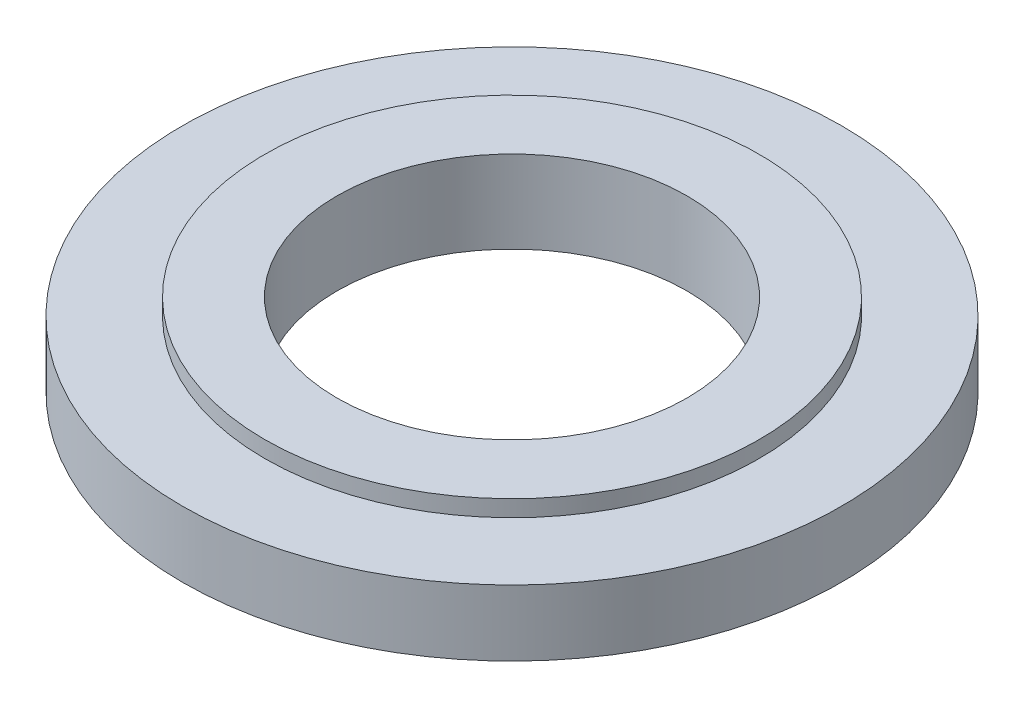
ISO-10303-21;
HEADER;
FILE_DESCRIPTION(('STEP AP214'),'2;1');
FILE_NAME('part.step','',(''),(''),'','','');
FILE_SCHEMA(('AUTOMOTIVE_DESIGN { 1 0 10303 214 1 1 1 1 }'));
ENDSEC;
DATA;
#1=APPLICATION_CONTEXT('core data for automotive mechanical design processes');
#2=APPLICATION_PROTOCOL_DEFINITION('international standard','automotive_design',2000,#1);
#3=PRODUCT_CONTEXT('',#1,'mechanical');
#4=PRODUCT('Part','Part','',(#3));
#5=PRODUCT_RELATED_PRODUCT_CATEGORY('part','',(#4));
#6=PRODUCT_DEFINITION_FORMATION('','',#4);
#7=PRODUCT_DEFINITION_CONTEXT('part definition',#1,'design');
#8=PRODUCT_DEFINITION('design','',#6,#7);
#9=PRODUCT_DEFINITION_SHAPE('','',#8);
#10=(LENGTH_UNIT() NAMED_UNIT(*) SI_UNIT(.MILLI.,.METRE.));
#11=(NAMED_UNIT(*) PLANE_ANGLE_UNIT() SI_UNIT($,.RADIAN.));
#12=(NAMED_UNIT(*) SI_UNIT($,.STERADIAN.) SOLID_ANGLE_UNIT());
#13=UNCERTAINTY_MEASURE_WITH_UNIT(LENGTH_MEASURE(1.E-05),#10,'distance_accuracy_value','');
#14=(GEOMETRIC_REPRESENTATION_CONTEXT(3) GLOBAL_UNCERTAINTY_ASSIGNED_CONTEXT((#13)) GLOBAL_UNIT_ASSIGNED_CONTEXT((#10,
#11,#12)) REPRESENTATION_CONTEXT('',''));
#15=CARTESIAN_POINT('',(0.,0.,0.));
#16=DIRECTION('',(0.,0.,1.));
#17=DIRECTION('',(1.,0.,0.));
#18=AXIS2_PLACEMENT_3D('',#15,#16,#17);
#19=CARTESIAN_POINT('',(0.,0.8,0.));
#20=DIRECTION('',(0.,1.,0.));
#21=DIRECTION('',(0.,0.,1.));
#22=AXIS2_PLACEMENT_3D('',#19,#20,#21);
#23=PLANE('',#22);
#24=CARTESIAN_POINT('',(0.,0.8,0.));
#25=DIRECTION('',(0.,1.,0.));
#26=DIRECTION('',(0.,0.,1.));
#27=AXIS2_PLACEMENT_3D('',#24,#25,#26);
#28=CIRCLE('',#27,4.);
#29=CARTESIAN_POINT('',(0.,0.8,4.));
#30=VERTEX_POINT('',#29);
#31=EDGE_CURVE('E10',#30,#30,#28,.T.);
#32=ORIENTED_EDGE('',*,*,#31,.T.);
#33=EDGE_LOOP('',(#32));
#34=FACE_BOUND('',#33,.T.);
#35=CARTESIAN_POINT('',(0.,0.8,0.));
#36=DIRECTION('',(0.,1.,0.));
#37=DIRECTION('',(0.,0.,1.));
#38=AXIS2_PLACEMENT_3D('',#35,#36,#37);
#39=CIRCLE('',#38,3.);
#40=CARTESIAN_POINT('',(0.,0.8,3.));
#41=VERTEX_POINT('',#40);
#42=EDGE_CURVE('E56',#41,#41,#39,.T.);
#43=ORIENTED_EDGE('',*,*,#42,.F.);
#44=EDGE_LOOP('',(#43));
#45=FACE_BOUND('',#44,.T.);
#46=ADVANCED_FACE('F37',(#34,#45),#23,.T.);
#47=CARTESIAN_POINT('',(0.,0.,0.));
#48=DIRECTION('',(0.,1.,0.));
#49=DIRECTION('',(0.,0.,1.));
#50=AXIS2_PLACEMENT_3D('',#47,#48,#49);
#51=PLANE('',#50);
#52=CARTESIAN_POINT('',(0.,0.,0.));
#53=DIRECTION('',(0.,1.,0.));
#54=DIRECTION('',(0.,0.,1.));
#55=AXIS2_PLACEMENT_3D('',#52,#53,#54);
#56=CIRCLE('',#55,4.);
#57=CARTESIAN_POINT('',(0.,0.,4.));
#58=VERTEX_POINT('',#57);
#59=EDGE_CURVE('E41',#58,#58,#56,.T.);
#60=ORIENTED_EDGE('',*,*,#59,.F.);
#61=EDGE_LOOP('',(#60));
#62=FACE_BOUND('',#61,.T.);
#63=CARTESIAN_POINT('',(0.,0.,0.));
#64=DIRECTION('',(0.,1.,0.));
#65=DIRECTION('',(0.,0.,1.));
#66=AXIS2_PLACEMENT_3D('',#63,#64,#65);
#67=CIRCLE('',#66,2.125);
#68=CARTESIAN_POINT('',(0.,0.,2.125));
#69=VERTEX_POINT('',#68);
#70=EDGE_CURVE('E50',#69,#69,#67,.T.);
#71=ORIENTED_EDGE('',*,*,#70,.T.);
#72=EDGE_LOOP('',(#71));
#73=FACE_BOUND('',#72,.T.);
#74=ADVANCED_FACE('F84',(#62,#73),#51,.F.);
#75=CARTESIAN_POINT('',(0.,0.8,0.));
#76=DIRECTION('',(0.,-1.,0.));
#77=DIRECTION('',(0.,0.,-1.));
#78=AXIS2_PLACEMENT_3D('',#75,#76,#77);
#79=CYLINDRICAL_SURFACE('',#78,4.);
#80=ORIENTED_EDGE('',*,*,#31,.F.);
#81=EDGE_LOOP('',(#80));
#82=FACE_BOUND('',#81,.T.);
#83=ORIENTED_EDGE('',*,*,#59,.T.);
#84=EDGE_LOOP('',(#83));
#85=FACE_BOUND('',#84,.T.);
#86=ADVANCED_FACE('F39',(#82,#85),#79,.T.);
#87=CARTESIAN_POINT('',(0.,0.8,0.));
#88=DIRECTION('',(0.,-1.,0.));
#89=DIRECTION('',(0.,0.,-1.));
#90=AXIS2_PLACEMENT_3D('',#87,#88,#89);
#91=CYLINDRICAL_SURFACE('',#90,2.125);
#92=ORIENTED_EDGE('',*,*,#70,.F.);
#93=EDGE_LOOP('',(#92));
#94=FACE_BOUND('',#93,.T.);
#95=CARTESIAN_POINT('',(0.,1.,0.));
#96=DIRECTION('',(0.,1.,0.));
#97=DIRECTION('',(0.,0.,1.));
#98=AXIS2_PLACEMENT_3D('',#95,#96,#97);
#99=CIRCLE('',#98,2.125);
#100=CARTESIAN_POINT('',(0.,1.,2.125));
#101=VERTEX_POINT('',#100);
#102=EDGE_CURVE('E60',#101,#101,#99,.T.);
#103=ORIENTED_EDGE('',*,*,#102,.T.);
#104=EDGE_LOOP('',(#103));
#105=FACE_BOUND('',#104,.T.);
#106=ADVANCED_FACE('F68',(#94,#105),#91,.F.);
#107=CARTESIAN_POINT('',(0.,1.,0.));
#108=DIRECTION('',(0.,1.,0.));
#109=DIRECTION('',(0.,0.,1.));
#110=AXIS2_PLACEMENT_3D('',#107,#108,#109);
#111=PLANE('',#110);
#112=CARTESIAN_POINT('',(0.,1.,0.));
#113=DIRECTION('',(0.,1.,0.));
#114=DIRECTION('',(0.,0.,1.));
#115=AXIS2_PLACEMENT_3D('',#112,#113,#114);
#116=CIRCLE('',#115,3.);
#117=CARTESIAN_POINT('',(0.,1.,3.));
#118=VERTEX_POINT('',#117);
#119=EDGE_CURVE('E55',#118,#118,#116,.T.);
#120=ORIENTED_EDGE('',*,*,#119,.T.);
#121=EDGE_LOOP('',(#120));
#122=FACE_BOUND('',#121,.T.);
#123=ORIENTED_EDGE('',*,*,#102,.F.);
#124=EDGE_LOOP('',(#123));
#125=FACE_BOUND('',#124,.T.);
#126=ADVANCED_FACE('F70',(#122,#125),#111,.T.);
#127=CARTESIAN_POINT('',(0.,1.,0.));
#128=DIRECTION('',(0.,-1.,0.));
#129=DIRECTION('',(0.,0.,-1.));
#130=AXIS2_PLACEMENT_3D('',#127,#128,#129);
#131=CYLINDRICAL_SURFACE('',#130,3.);
#132=ORIENTED_EDGE('',*,*,#119,.F.);
#133=EDGE_LOOP('',(#132));
#134=FACE_BOUND('',#133,.T.);
#135=ORIENTED_EDGE('',*,*,#42,.T.);
#136=EDGE_LOOP('',(#135));
#137=FACE_BOUND('',#136,.T.);
#138=ADVANCED_FACE('F72',(#134,#137),#131,.T.);
#139=CLOSED_SHELL('',(#46,#74,#86,#106,#126,#138));
#140=MANIFOLD_SOLID_BREP('B2',#139);
#141=ADVANCED_BREP_SHAPE_REPRESENTATION('',(#18,#140),#14);
#142=SHAPE_DEFINITION_REPRESENTATION(#9,#141);
ENDSEC;
END-ISO-10303-21;
